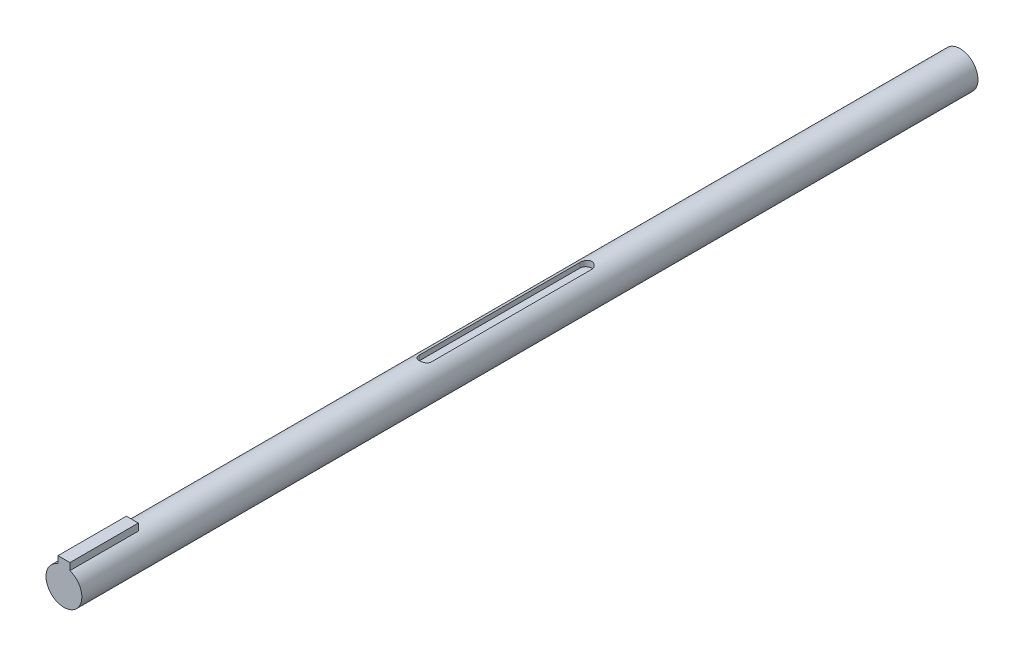
ISO-10303-21;
HEADER;
FILE_DESCRIPTION(('STEP AP214'),'2;1');
FILE_NAME('part.step','',(''),(''),'','','');
FILE_SCHEMA(('AUTOMOTIVE_DESIGN { 1 0 10303 214 1 1 1 1 }'));
ENDSEC;
DATA;
#1=APPLICATION_CONTEXT('core data for automotive mechanical design processes');
#2=APPLICATION_PROTOCOL_DEFINITION('international standard','automotive_design',2000,#1);
#3=PRODUCT_CONTEXT('',#1,'mechanical');
#4=PRODUCT('Part','Part','',(#3));
#5=PRODUCT_RELATED_PRODUCT_CATEGORY('part','',(#4));
#6=PRODUCT_DEFINITION_FORMATION('','',#4);
#7=PRODUCT_DEFINITION_CONTEXT('part definition',#1,'design');
#8=PRODUCT_DEFINITION('design','',#6,#7);
#9=PRODUCT_DEFINITION_SHAPE('','',#8);
#10=(LENGTH_UNIT() NAMED_UNIT(*) SI_UNIT(.MILLI.,.METRE.));
#11=(NAMED_UNIT(*) PLANE_ANGLE_UNIT() SI_UNIT($,.RADIAN.));
#12=(NAMED_UNIT(*) SI_UNIT($,.STERADIAN.) SOLID_ANGLE_UNIT());
#13=UNCERTAINTY_MEASURE_WITH_UNIT(LENGTH_MEASURE(1.E-05),#10,'distance_accuracy_value','');
#14=(GEOMETRIC_REPRESENTATION_CONTEXT(3) GLOBAL_UNCERTAINTY_ASSIGNED_CONTEXT((#13)) GLOBAL_UNIT_ASSIGNED_CONTEXT((#10,
#11,#12)) REPRESENTATION_CONTEXT('',''));
#15=CARTESIAN_POINT('',(0.,0.,0.));
#16=DIRECTION('',(0.,0.,1.));
#17=DIRECTION('',(1.,0.,0.));
#18=AXIS2_PLACEMENT_3D('',#15,#16,#17);
#19=CARTESIAN_POINT('',(0.,0.,300.));
#20=DIRECTION('',(0.,0.,-1.));
#21=DIRECTION('',(-1.,0.,0.));
#22=AXIS2_PLACEMENT_3D('',#19,#20,#21);
#23=CYLINDRICAL_SURFACE('',#22,6.);
#24=DIRECTION('',(0.,0.,-1.));
#25=VECTOR('',#24,1.);
#26=CARTESIAN_POINT('',(2.00000000000002,5.65685424949237,300.));
#27=LINE('',#26,#25);
#28=CARTESIAN_POINT('',(2.,5.65685424949237,125.29796428968));
#29=VERTEX_POINT('',#28);
#30=CARTESIAN_POINT('',(2.00000000000001,5.65685424949238,179.002027521972));
#31=VERTEX_POINT('',#30);
#32=EDGE_CURVE('E11',#29,#31,#27,.F.);
#33=ORIENTED_EDGE('',*,*,#32,.T.);
#34=CARTESIAN_POINT('',(2.,5.65685424949238,179.002027521972));
#35=CARTESIAN_POINT('',(2.0000014949184,5.65684884188678,179.056608515574));
#36=CARTESIAN_POINT('',(1.99776424917479,5.6576451988649,179.111161646351));
#37=CARTESIAN_POINT('',(1.9888512140728,5.66078654578442,179.219844690082));
#38=CARTESIAN_POINT('',(1.98217662286705,5.66313111768244,179.273974713292));
#39=CARTESIAN_POINT('',(1.95562135046157,5.67238184449301,179.434811808362));
#40=CARTESIAN_POINT('',(1.92920846605622,5.6815058499903,179.540389214513));
#41=CARTESIAN_POINT('',(1.85991682366085,5.70456149397718,179.74527790686));
#42=CARTESIAN_POINT('',(1.81704715197506,5.71849047905858,179.844592615718));
#43=CARTESIAN_POINT('',(1.71614645792973,5.74957574438921,180.034707189983));
#44=CARTESIAN_POINT('',(1.65810612564546,5.76673400456216,180.125501780107));
#45=CARTESIAN_POINT('',(1.52610278704602,5.80308960804095,180.299467984621));
#46=CARTESIAN_POINT('',(1.45164996064407,5.82233755536618,180.382257282897));
#47=CARTESIAN_POINT('',(1.28997688598296,5.86027697385956,180.534439557556));
#48=CARTESIAN_POINT('',(1.20275436910906,5.87896834543706,180.603830148484));
#49=CARTESIAN_POINT('',(1.01520729191252,5.91427765988454,180.728986559581));
#50=CARTESIAN_POINT('',(0.914600178716988,5.93082875123708,180.784349490777));
#51=CARTESIAN_POINT('',(0.704858499931718,5.95939217209316,180.877212025347));
#52=CARTESIAN_POINT('',(0.595726551186838,5.97140588786619,180.914717085613));
#53=CARTESIAN_POINT('',(0.37605869095607,5.98918142285845,180.969498974155));
#54=CARTESIAN_POINT('',(0.265703668920221,5.99514617977147,180.98743406708));
#55=CARTESIAN_POINT('',(0.0433979389113433,6.00087216807633,181.004660119023));
#56=CARTESIAN_POINT('',(-0.0685523824907881,6.00063487762605,181.003955520512));
#57=CARTESIAN_POINT('',(-0.286207690558788,5.99412077270532,180.984338955759));
#58=CARTESIAN_POINT('',(-0.391985405251076,5.98808121982527,180.966142246053));
#59=CARTESIAN_POINT('',(-0.598888128753318,5.97093921001647,180.913241124624));
#60=CARTESIAN_POINT('',(-0.700012879232936,5.95983647235462,180.87853579756));
#61=CARTESIAN_POINT('',(-0.896305246061935,5.93351336542608,180.793184782771));
#62=CARTESIAN_POINT('',(-0.991377011307994,5.91824075676625,180.742335431728));
#63=CARTESIAN_POINT('',(-1.17184917819498,5.88516775360088,180.626307619191));
#64=CARTESIAN_POINT('',(-1.25724693942937,5.86736667195186,180.561125259879));
#65=CARTESIAN_POINT('',(-1.42019467942243,5.83012543885479,180.414685421979));
#66=CARTESIAN_POINT('',(-1.4971872232254,5.81064757359828,180.332816434753));
#67=CARTESIAN_POINT('',(-1.63654404964076,5.77294980945702,180.15714454254));
#68=CARTESIAN_POINT('',(-1.69890360636762,5.75473031831506,180.063337797166));
#69=CARTESIAN_POINT('',(-1.80800665118556,5.72140062752635,179.864667165266));
#70=CARTESIAN_POINT('',(-1.85450601901536,5.70634029896469,179.759660492106));
#71=CARTESIAN_POINT('',(-1.92892046140223,5.68162194124078,179.542733566792));
#72=CARTESIAN_POINT('',(-1.95686487211072,5.67195538817985,179.430824535228));
#73=CARTESIAN_POINT('',(-1.98331631256166,5.6627308418944,179.265190248476));
#74=CARTESIAN_POINT('',(-1.98957012251024,5.66053335389203,179.212744742264));
#75=CARTESIAN_POINT('',(-1.9979092321424,5.65759407142798,179.107551365173));
#76=CARTESIAN_POINT('',(-1.99999991078996,5.65685039859056,179.054803972883));
#77=CARTESIAN_POINT('',(-2.,5.65685424949238,179.002027521972));
#78=B_SPLINE_CURVE_WITH_KNOTS('',3,(#34,#35,#36,#37,#38,#39,#40,#41,#42,#43,#44,#45,#46,#47,#48,
#49,#50,#51,#52,#53,#54,#55,#56,#57,#58,#59,#60,#61,#62,#63,#64,#65,#66,#67,#68,#69,#70,#71,#72,
#73,#74,#75,#76,#77),.UNSPECIFIED.,.F.,.F.,(4,2,2,2,2,2,2,2,2,2,2,2,2,2,2,2,2,2,2,2,2,4),(0.,
0.163636969470881,0.327229772338919,0.653162396790756,0.978915321932497,1.30486862627063,
1.64233009925355,1.97985159727495,2.32618265866202,2.67240782242254,3.00658941454805,
3.34069136061284,3.6616883693147,3.98270317816495,4.30794037651935,4.63326613177537,
4.97388108116099,5.31460588498483,5.66036059856075,6.0055673497368,6.16399790665509,
6.32222363058112),.UNSPECIFIED.);
#79=CARTESIAN_POINT('',(-2.,5.65685424949239,179.002027521972));
#80=VERTEX_POINT('',#79);
#81=EDGE_CURVE('E170',#31,#80,#78,.T.);
#82=ORIENTED_EDGE('',*,*,#81,.T.);
#83=DIRECTION('',(0.,0.,-1.));
#84=VECTOR('',#83,1.);
#85=CARTESIAN_POINT('',(-1.99999999999998,5.65685424949239,300.));
#86=LINE('',#85,#84);
#87=CARTESIAN_POINT('',(-1.99999999999998,5.65685424949239,125.29796428968));
#88=VERTEX_POINT('',#87);
#89=EDGE_CURVE('E50',#80,#88,#86,.T.);
#90=ORIENTED_EDGE('',*,*,#89,.T.);
#91=CARTESIAN_POINT('',(-2.,5.65685424949238,125.29796428968));
#92=CARTESIAN_POINT('',(-2.0000014949184,5.65684884188678,125.243383296078));
#93=CARTESIAN_POINT('',(-1.99776424917478,5.6576451988649,125.188830165301));
#94=CARTESIAN_POINT('',(-1.9888512140728,5.66078654578442,125.08014712157));
#95=CARTESIAN_POINT('',(-1.98217662286705,5.66313111768244,125.02601709836));
#96=CARTESIAN_POINT('',(-1.95562135046158,5.67238184449301,124.86518000329));
#97=CARTESIAN_POINT('',(-1.92920846605623,5.6815058499903,124.759602597139));
#98=CARTESIAN_POINT('',(-1.85991682366086,5.70456149397718,124.554713904792));
#99=CARTESIAN_POINT('',(-1.81704715197507,5.71849047905858,124.455399195934));
#100=CARTESIAN_POINT('',(-1.71614645792974,5.74957574438921,124.265284621669));
#101=CARTESIAN_POINT('',(-1.65810612564547,5.76673400456216,124.174490031545));
#102=CARTESIAN_POINT('',(-1.52610278704602,5.80308960804095,124.000523827031));
#103=CARTESIAN_POINT('',(-1.45164996064407,5.82233755536618,123.917734528755));
#104=CARTESIAN_POINT('',(-1.28997688598296,5.86027697385956,123.765552254096));
#105=CARTESIAN_POINT('',(-1.20275436910907,5.87896834543705,123.696161663168));
#106=CARTESIAN_POINT('',(-1.01520729191253,5.91427765988454,123.571005252071));
#107=CARTESIAN_POINT('',(-0.914600178716994,5.93082875123708,123.515642320875));
#108=CARTESIAN_POINT('',(-0.704858499931719,5.95939217209316,123.422779786305));
#109=CARTESIAN_POINT('',(-0.595726551186839,5.97140588786619,123.385274726039));
#110=CARTESIAN_POINT('',(-0.376058690956073,5.98918142285845,123.330492837497));
#111=CARTESIAN_POINT('',(-0.265703668920225,5.99514617977146,123.312557744572));
#112=CARTESIAN_POINT('',(-0.0433979389113491,6.00087216807633,123.295331692629));
#113=CARTESIAN_POINT('',(0.0685523824907808,6.00063487762605,123.29603629114));
#114=CARTESIAN_POINT('',(0.28620769055878,5.99412077270532,123.315652855893));
#115=CARTESIAN_POINT('',(0.391985405251069,5.98808121982527,123.333849565599));
#116=CARTESIAN_POINT('',(0.598888128753309,5.97093921001647,123.386750687028));
#117=CARTESIAN_POINT('',(0.700012879232925,5.95983647235462,123.421456014092));
#118=CARTESIAN_POINT('',(0.896305246061923,5.93351336542608,123.506807028881));
#119=CARTESIAN_POINT('',(0.991377011307984,5.91824075676625,123.557656379924));
#120=CARTESIAN_POINT('',(1.17184917819498,5.88516775360088,123.673684192461));
#121=CARTESIAN_POINT('',(1.25724693942937,5.86736667195186,123.738866551773));
#122=CARTESIAN_POINT('',(1.42019467942242,5.83012543885479,123.885306389674));
#123=CARTESIAN_POINT('',(1.4971872232254,5.81064757359828,123.967175376899));
#124=CARTESIAN_POINT('',(1.63654404964077,5.77294980945702,124.142847269112));
#125=CARTESIAN_POINT('',(1.69890360636762,5.75473031831506,124.236654014486));
#126=CARTESIAN_POINT('',(1.80800665118556,5.72140062752635,124.435324646386));
#127=CARTESIAN_POINT('',(1.85450601901536,5.70634029896469,124.540331319546));
#128=CARTESIAN_POINT('',(1.92892046140223,5.68162194124078,124.75725824486));
#129=CARTESIAN_POINT('',(1.95686487211071,5.67195538817986,124.869167276424));
#130=CARTESIAN_POINT('',(1.98331631256165,5.6627308418944,125.034801563176));
#131=CARTESIAN_POINT('',(1.98957012251023,5.66053335389204,125.087247069388));
#132=CARTESIAN_POINT('',(1.99790923214239,5.65759407142798,125.192440446479));
#133=CARTESIAN_POINT('',(1.99999991078996,5.65685039859056,125.245187838769));
#134=CARTESIAN_POINT('',(2.,5.65685424949238,125.29796428968));
#135=B_SPLINE_CURVE_WITH_KNOTS('',3,(#91,#92,#93,#94,#95,#96,#97,#98,#99,#100,#101,#102,#103,
#104,#105,#106,#107,#108,#109,#110,#111,#112,#113,#114,#115,#116,#117,#118,#119,#120,#121,#122,
#123,#124,#125,#126,#127,#128,#129,#130,#131,#132,#133,#134),.UNSPECIFIED.,.F.,.F.,(4,2,2,2,2,2,
2,2,2,2,2,2,2,2,2,2,2,2,2,2,2,4),(0.,0.163636969470881,0.327229772338919,0.653162396790742,
0.978915321932466,1.30486862627062,1.64233009925356,1.97985159727495,2.32618265866203,
2.67240782242254,3.00658941454806,3.34069136061284,3.6616883693147,3.98270317816495,
4.30794037651935,4.63326613177537,4.973881081161,5.31460588498485,5.6603605985608,
6.00556734973679,6.16399790665499,6.32222363058113),.UNSPECIFIED.);
#136=EDGE_CURVE('E53',#88,#29,#135,.T.);
#137=ORIENTED_EDGE('',*,*,#136,.T.);
#138=EDGE_LOOP('',(#33,#82,#90,#137));
#139=FACE_BOUND('',#138,.T.);
#140=CARTESIAN_POINT('',(0.,0.,277.09));
#141=DIRECTION('',(0.,0.,1.));
#142=DIRECTION('',(1.,0.,0.));
#143=AXIS2_PLACEMENT_3D('',#140,#141,#142);
#144=CIRCLE('',#143,6.);
#145=CARTESIAN_POINT('',(2.,5.65685424949238,277.09));
#146=VERTEX_POINT('',#145);
#147=CARTESIAN_POINT('',(-2.,5.65685424949238,277.09));
#148=VERTEX_POINT('',#147);
#149=EDGE_CURVE('E64',#146,#148,#144,.T.);
#150=ORIENTED_EDGE('',*,*,#149,.F.);
#151=DIRECTION('',(0.,0.,-1.));
#152=VECTOR('',#151,1.);
#153=CARTESIAN_POINT('',(2.,5.65685424949238,300.));
#154=LINE('',#153,#152);
#155=CARTESIAN_POINT('',(2.,5.65685424949238,300.));
#156=VERTEX_POINT('',#155);
#157=EDGE_CURVE('E158',#146,#156,#154,.F.);
#158=ORIENTED_EDGE('',*,*,#157,.T.);
#159=CARTESIAN_POINT('',(0.,0.,300.));
#160=DIRECTION('',(0.,0.,1.));
#161=DIRECTION('',(1.,0.,0.));
#162=AXIS2_PLACEMENT_3D('',#159,#160,#161);
#163=CIRCLE('',#162,6.);
#164=CARTESIAN_POINT('',(-2.,5.65685424949238,300.));
#165=VERTEX_POINT('',#164);
#166=EDGE_CURVE('E161',#165,#156,#163,.T.);
#167=ORIENTED_EDGE('',*,*,#166,.F.);
#168=DIRECTION('',(0.,0.,-1.));
#169=VECTOR('',#168,1.);
#170=CARTESIAN_POINT('',(-2.,5.65685424949238,300.));
#171=LINE('',#170,#169);
#172=EDGE_CURVE('E152',#165,#148,#171,.T.);
#173=ORIENTED_EDGE('',*,*,#172,.T.);
#174=EDGE_LOOP('',(#150,#158,#167,#173));
#175=FACE_BOUND('',#174,.T.);
#176=CARTESIAN_POINT('',(0.,0.,0.));
#177=DIRECTION('',(0.,0.,1.));
#178=DIRECTION('',(1.,0.,0.));
#179=AXIS2_PLACEMENT_3D('',#176,#177,#178);
#180=CIRCLE('',#179,6.);
#181=CARTESIAN_POINT('',(6.,0.,0.));
#182=VERTEX_POINT('',#181);
#183=EDGE_CURVE('E159',#182,#182,#180,.T.);
#184=ORIENTED_EDGE('',*,*,#183,.T.);
#185=EDGE_LOOP('',(#184));
#186=FACE_BOUND('',#185,.T.);
#187=ADVANCED_FACE('F39',(#139,#175,#186),#23,.T.);
#188=CARTESIAN_POINT('',(0.,0.,300.));
#189=DIRECTION('',(0.,0.,1.));
#190=DIRECTION('',(1.,0.,0.));
#191=AXIS2_PLACEMENT_3D('',#188,#189,#190);
#192=PLANE('',#191);
#193=ORIENTED_EDGE('',*,*,#166,.T.);
#194=DIRECTION('',(0.,1.,0.));
#195=VECTOR('',#194,1.);
#196=CARTESIAN_POINT('',(2.,8.,300.));
#197=LINE('',#196,#195);
#198=CARTESIAN_POINT('',(2.,8.,300.));
#199=VERTEX_POINT('',#198);
#200=EDGE_CURVE('E133',#156,#199,#197,.T.);
#201=ORIENTED_EDGE('',*,*,#200,.T.);
#202=DIRECTION('',(-1.,0.,0.));
#203=VECTOR('',#202,1.);
#204=CARTESIAN_POINT('',(-2.,8.,300.));
#205=LINE('',#204,#203);
#206=CARTESIAN_POINT('',(-2.,8.,300.));
#207=VERTEX_POINT('',#206);
#208=EDGE_CURVE('E150',#199,#207,#205,.T.);
#209=ORIENTED_EDGE('',*,*,#208,.T.);
#210=DIRECTION('',(0.,-1.,0.));
#211=VECTOR('',#210,1.);
#212=CARTESIAN_POINT('',(-2.,8.,300.));
#213=LINE('',#212,#211);
#214=EDGE_CURVE('E139',#207,#165,#213,.T.);
#215=ORIENTED_EDGE('',*,*,#214,.T.);
#216=EDGE_LOOP('',(#193,#201,#209,#215));
#217=FACE_BOUND('',#216,.T.);
#218=ADVANCED_FACE('F207',(#217),#192,.T.);
#219=CARTESIAN_POINT('',(0.,0.,0.));
#220=DIRECTION('',(0.,0.,1.));
#221=DIRECTION('',(1.,0.,0.));
#222=AXIS2_PLACEMENT_3D('',#219,#220,#221);
#223=PLANE('',#222);
#224=ORIENTED_EDGE('',*,*,#183,.F.);
#225=EDGE_LOOP('',(#224));
#226=FACE_BOUND('',#225,.T.);
#227=ADVANCED_FACE('F210',(#226),#223,.F.);
#228=CARTESIAN_POINT('',(2.,8.,277.09));
#229=DIRECTION('',(1.,0.,0.));
#230=DIRECTION('',(0.,0.,-1.));
#231=AXIS2_PLACEMENT_3D('',#228,#229,#230);
#232=PLANE('',#231);
#233=ORIENTED_EDGE('',*,*,#157,.F.);
#234=DIRECTION('',(0.,1.,0.));
#235=VECTOR('',#234,1.);
#236=CARTESIAN_POINT('',(2.,8.,277.09));
#237=LINE('',#236,#235);
#238=CARTESIAN_POINT('',(2.,8.,277.09));
#239=VERTEX_POINT('',#238);
#240=EDGE_CURVE('E137',#146,#239,#237,.T.);
#241=ORIENTED_EDGE('',*,*,#240,.T.);
#242=DIRECTION('',(0.,0.,1.));
#243=VECTOR('',#242,1.);
#244=CARTESIAN_POINT('',(2.,8.,277.09));
#245=LINE('',#244,#243);
#246=EDGE_CURVE('E144',#239,#199,#245,.T.);
#247=ORIENTED_EDGE('',*,*,#246,.T.);
#248=ORIENTED_EDGE('',*,*,#200,.F.);
#249=EDGE_LOOP('',(#233,#241,#247,#248));
#250=FACE_BOUND('',#249,.T.);
#251=ADVANCED_FACE('F199',(#250),#232,.T.);
#252=CARTESIAN_POINT('',(-2.,8.,277.09));
#253=DIRECTION('',(-1.,0.,0.));
#254=DIRECTION('',(0.,0.,1.));
#255=AXIS2_PLACEMENT_3D('',#252,#253,#254);
#256=PLANE('',#255);
#257=ORIENTED_EDGE('',*,*,#172,.F.);
#258=ORIENTED_EDGE('',*,*,#214,.F.);
#259=DIRECTION('',(0.,0.,1.));
#260=VECTOR('',#259,1.);
#261=CARTESIAN_POINT('',(-2.,8.,277.09));
#262=LINE('',#261,#260);
#263=CARTESIAN_POINT('',(-2.,8.,277.09));
#264=VERTEX_POINT('',#263);
#265=EDGE_CURVE('E155',#264,#207,#262,.T.);
#266=ORIENTED_EDGE('',*,*,#265,.F.);
#267=DIRECTION('',(0.,-1.,0.));
#268=VECTOR('',#267,1.);
#269=CARTESIAN_POINT('',(-2.,8.,277.09));
#270=LINE('',#269,#268);
#271=EDGE_CURVE('E142',#264,#148,#270,.T.);
#272=ORIENTED_EDGE('',*,*,#271,.T.);
#273=EDGE_LOOP('',(#257,#258,#266,#272));
#274=FACE_BOUND('',#273,.T.);
#275=ADVANCED_FACE('F197',(#274),#256,.T.);
#276=CARTESIAN_POINT('',(-2.,8.,277.09));
#277=DIRECTION('',(0.,1.,0.));
#278=DIRECTION('',(0.,0.,1.));
#279=AXIS2_PLACEMENT_3D('',#276,#277,#278);
#280=PLANE('',#279);
#281=ORIENTED_EDGE('',*,*,#208,.F.);
#282=ORIENTED_EDGE('',*,*,#246,.F.);
#283=DIRECTION('',(-1.,0.,0.));
#284=VECTOR('',#283,1.);
#285=CARTESIAN_POINT('',(-2.,8.,277.09));
#286=LINE('',#285,#284);
#287=EDGE_CURVE('E138',#239,#264,#286,.T.);
#288=ORIENTED_EDGE('',*,*,#287,.T.);
#289=ORIENTED_EDGE('',*,*,#265,.T.);
#290=EDGE_LOOP('',(#281,#282,#288,#289));
#291=FACE_BOUND('',#290,.T.);
#292=ADVANCED_FACE('F191',(#291),#280,.T.);
#293=CARTESIAN_POINT('',(0.,0.,277.09));
#294=DIRECTION('',(0.,0.,1.));
#295=DIRECTION('',(1.,0.,0.));
#296=AXIS2_PLACEMENT_3D('',#293,#294,#295);
#297=PLANE('',#296);
#298=ORIENTED_EDGE('',*,*,#240,.F.);
#299=ORIENTED_EDGE('',*,*,#149,.T.);
#300=ORIENTED_EDGE('',*,*,#271,.F.);
#301=ORIENTED_EDGE('',*,*,#287,.F.);
#302=EDGE_LOOP('',(#298,#299,#300,#301));
#303=FACE_BOUND('',#302,.T.);
#304=ADVANCED_FACE('F195',(#303),#297,.F.);
#305=CARTESIAN_POINT('',(0.,4.,125.29796428968));
#306=DIRECTION('',(0.,1.,0.));
#307=DIRECTION('',(0.,0.,1.));
#308=AXIS2_PLACEMENT_3D('',#305,#306,#307);
#309=CYLINDRICAL_SURFACE('',#308,2.);
#310=DIRECTION('',(0.,1.,0.));
#311=VECTOR('',#310,1.);
#312=CARTESIAN_POINT('',(-2.,4.,125.29796428968));
#313=LINE('',#312,#311);
#314=CARTESIAN_POINT('',(-2.,4.,125.29796428968));
#315=VERTEX_POINT('',#314);
#316=EDGE_CURVE('E103',#315,#88,#313,.T.);
#317=ORIENTED_EDGE('',*,*,#316,.F.);
#318=CARTESIAN_POINT('',(0.,4.,125.29796428968));
#319=DIRECTION('',(0.,1.,0.));
#320=DIRECTION('',(0.,0.,1.));
#321=AXIS2_PLACEMENT_3D('',#318,#319,#320);
#322=CIRCLE('',#321,2.);
#323=CARTESIAN_POINT('',(2.,4.,125.29796428968));
#324=VERTEX_POINT('',#323);
#325=EDGE_CURVE('E110',#324,#315,#322,.T.);
#326=ORIENTED_EDGE('',*,*,#325,.F.);
#327=DIRECTION('',(0.,1.,0.));
#328=VECTOR('',#327,1.);
#329=CARTESIAN_POINT('',(2.,4.,125.29796428968));
#330=LINE('',#329,#328);
#331=EDGE_CURVE('E129',#324,#29,#330,.T.);
#332=ORIENTED_EDGE('',*,*,#331,.T.);
#333=ORIENTED_EDGE('',*,*,#136,.F.);
#334=EDGE_LOOP('',(#317,#326,#332,#333));
#335=FACE_BOUND('',#334,.T.);
#336=ADVANCED_FACE('F104',(#335),#309,.F.);
#337=CARTESIAN_POINT('',(2.,4.,125.29796428968));
#338=DIRECTION('',(1.,0.,0.));
#339=DIRECTION('',(0.,0.,-1.));
#340=AXIS2_PLACEMENT_3D('',#337,#338,#339);
#341=PLANE('',#340);
#342=ORIENTED_EDGE('',*,*,#331,.F.);
#343=DIRECTION('',(0.,0.,-1.));
#344=VECTOR('',#343,1.);
#345=CARTESIAN_POINT('',(2.,4.,125.29796428968));
#346=LINE('',#345,#344);
#347=CARTESIAN_POINT('',(2.00000000000001,4.,179.002027521972));
#348=VERTEX_POINT('',#347);
#349=EDGE_CURVE('E115',#348,#324,#346,.T.);
#350=ORIENTED_EDGE('',*,*,#349,.F.);
#351=DIRECTION('',(0.,1.,0.));
#352=VECTOR('',#351,1.);
#353=CARTESIAN_POINT('',(2.00000000000001,4.,179.002027521972));
#354=LINE('',#353,#352);
#355=EDGE_CURVE('E134',#348,#31,#354,.T.);
#356=ORIENTED_EDGE('',*,*,#355,.T.);
#357=ORIENTED_EDGE('',*,*,#32,.F.);
#358=EDGE_LOOP('',(#342,#350,#356,#357));
#359=FACE_BOUND('',#358,.T.);
#360=ADVANCED_FACE('F183',(#359),#341,.F.);
#361=CARTESIAN_POINT('',(0.,4.,179.002027521972));
#362=DIRECTION('',(0.,1.,0.));
#363=DIRECTION('',(0.,0.,1.));
#364=AXIS2_PLACEMENT_3D('',#361,#362,#363);
#365=CYLINDRICAL_SURFACE('',#364,2.);
#366=ORIENTED_EDGE('',*,*,#355,.F.);
#367=CARTESIAN_POINT('',(0.,4.,179.002027521972));
#368=DIRECTION('',(0.,1.,0.));
#369=DIRECTION('',(0.,0.,1.));
#370=AXIS2_PLACEMENT_3D('',#367,#368,#369);
#371=CIRCLE('',#370,2.);
#372=CARTESIAN_POINT('',(-2.,4.,179.002027521972));
#373=VERTEX_POINT('',#372);
#374=EDGE_CURVE('E122',#373,#348,#371,.T.);
#375=ORIENTED_EDGE('',*,*,#374,.F.);
#376=DIRECTION('',(0.,1.,0.));
#377=VECTOR('',#376,1.);
#378=CARTESIAN_POINT('',(-2.,4.,179.002027521972));
#379=LINE('',#378,#377);
#380=EDGE_CURVE('E112',#373,#80,#379,.T.);
#381=ORIENTED_EDGE('',*,*,#380,.T.);
#382=ORIENTED_EDGE('',*,*,#81,.F.);
#383=EDGE_LOOP('',(#366,#375,#381,#382));
#384=FACE_BOUND('',#383,.T.);
#385=ADVANCED_FACE('F176',(#384),#365,.F.);
#386=CARTESIAN_POINT('',(-2.,4.,125.29796428968));
#387=DIRECTION('',(-1.,0.,0.));
#388=DIRECTION('',(0.,0.,1.));
#389=AXIS2_PLACEMENT_3D('',#386,#387,#388);
#390=PLANE('',#389);
#391=ORIENTED_EDGE('',*,*,#380,.F.);
#392=DIRECTION('',(0.,0.,1.));
#393=VECTOR('',#392,1.);
#394=CARTESIAN_POINT('',(-2.,4.,125.29796428968));
#395=LINE('',#394,#393);
#396=EDGE_CURVE('E113',#315,#373,#395,.T.);
#397=ORIENTED_EDGE('',*,*,#396,.F.);
#398=ORIENTED_EDGE('',*,*,#316,.T.);
#399=ORIENTED_EDGE('',*,*,#89,.F.);
#400=EDGE_LOOP('',(#391,#397,#398,#399));
#401=FACE_BOUND('',#400,.T.);
#402=ADVANCED_FACE('F118',(#401),#390,.F.);
#403=CARTESIAN_POINT('',(0.,4.,125.29796428968));
#404=DIRECTION('',(0.,1.,0.));
#405=DIRECTION('',(0.,0.,1.));
#406=AXIS2_PLACEMENT_3D('',#403,#404,#405);
#407=PLANE('',#406);
#408=ORIENTED_EDGE('',*,*,#325,.T.);
#409=ORIENTED_EDGE('',*,*,#396,.T.);
#410=ORIENTED_EDGE('',*,*,#374,.T.);
#411=ORIENTED_EDGE('',*,*,#349,.T.);
#412=EDGE_LOOP('',(#408,#409,#410,#411));
#413=FACE_BOUND('',#412,.T.);
#414=ADVANCED_FACE('F123',(#413),#407,.T.);
#415=CLOSED_SHELL('',(#187,#218,#227,#251,#275,#292,#304,#336,#360,#385,#402,#414));
#416=MANIFOLD_SOLID_BREP('B2',#415);
#417=ADVANCED_BREP_SHAPE_REPRESENTATION('',(#18,#416),#14);
#418=SHAPE_DEFINITION_REPRESENTATION(#9,#417);
ENDSEC;
END-ISO-10303-21;
